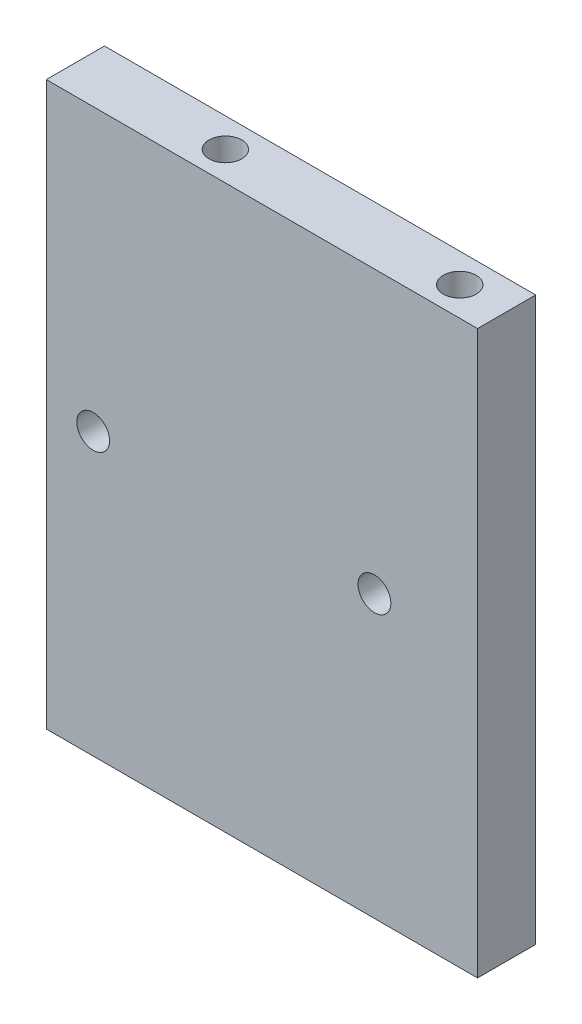
ISO-10303-21;
HEADER;
FILE_DESCRIPTION(('STEP AP214'),'2;1');
FILE_NAME('part.step','',(''),(''),'','','');
FILE_SCHEMA(('AUTOMOTIVE_DESIGN { 1 0 10303 214 1 1 1 1 }'));
ENDSEC;
DATA;
#1=APPLICATION_CONTEXT('core data for automotive mechanical design processes');
#2=APPLICATION_PROTOCOL_DEFINITION('international standard','automotive_design',2000,#1);
#3=PRODUCT_CONTEXT('',#1,'mechanical');
#4=PRODUCT('Part','Part','',(#3));
#5=PRODUCT_RELATED_PRODUCT_CATEGORY('part','',(#4));
#6=PRODUCT_DEFINITION_FORMATION('','',#4);
#7=PRODUCT_DEFINITION_CONTEXT('part definition',#1,'design');
#8=PRODUCT_DEFINITION('design','',#6,#7);
#9=PRODUCT_DEFINITION_SHAPE('','',#8);
#10=(LENGTH_UNIT() NAMED_UNIT(*) SI_UNIT(.MILLI.,.METRE.));
#11=(NAMED_UNIT(*) PLANE_ANGLE_UNIT() SI_UNIT($,.RADIAN.));
#12=(NAMED_UNIT(*) SI_UNIT($,.STERADIAN.) SOLID_ANGLE_UNIT());
#13=UNCERTAINTY_MEASURE_WITH_UNIT(LENGTH_MEASURE(1.E-05),#10,'distance_accuracy_value','');
#14=(GEOMETRIC_REPRESENTATION_CONTEXT(3) GLOBAL_UNCERTAINTY_ASSIGNED_CONTEXT((#13)) GLOBAL_UNIT_ASSIGNED_CONTEXT((#10,
#11,#12)) REPRESENTATION_CONTEXT('',''));
#15=CARTESIAN_POINT('',(0.,0.,0.));
#16=DIRECTION('',(0.,0.,1.));
#17=DIRECTION('',(1.,0.,0.));
#18=AXIS2_PLACEMENT_3D('',#15,#16,#17);
#19=CARTESIAN_POINT('',(23.,30.,6.2));
#20=DIRECTION('',(-1.,0.,0.));
#21=DIRECTION('',(0.,0.,1.));
#22=AXIS2_PLACEMENT_3D('',#19,#20,#21);
#23=PLANE('',#22);
#24=DIRECTION('',(0.,1.,0.));
#25=VECTOR('',#24,1.);
#26=CARTESIAN_POINT('',(23.,30.,0.));
#27=LINE('',#26,#25);
#28=CARTESIAN_POINT('',(23.,-30.,0.));
#29=VERTEX_POINT('',#28);
#30=CARTESIAN_POINT('',(23.,30.,0.));
#31=VERTEX_POINT('',#30);
#32=EDGE_CURVE('E116',#29,#31,#27,.T.);
#33=ORIENTED_EDGE('',*,*,#32,.T.);
#34=DIRECTION('',(0.,0.,-1.));
#35=VECTOR('',#34,1.);
#36=CARTESIAN_POINT('',(23.,30.,6.2));
#37=LINE('',#36,#35);
#38=CARTESIAN_POINT('',(23.,30.,6.2));
#39=VERTEX_POINT('',#38);
#40=EDGE_CURVE('E12',#39,#31,#37,.T.);
#41=ORIENTED_EDGE('',*,*,#40,.F.);
#42=DIRECTION('',(0.,1.,0.));
#43=VECTOR('',#42,1.);
#44=CARTESIAN_POINT('',(23.,30.,6.2));
#45=LINE('',#44,#43);
#46=CARTESIAN_POINT('',(23.,-30.,6.2));
#47=VERTEX_POINT('',#46);
#48=EDGE_CURVE('E100',#47,#39,#45,.T.);
#49=ORIENTED_EDGE('',*,*,#48,.F.);
#50=DIRECTION('',(0.,0.,-1.));
#51=VECTOR('',#50,1.);
#52=CARTESIAN_POINT('',(23.,-30.,6.2));
#53=LINE('',#52,#51);
#54=EDGE_CURVE('E112',#47,#29,#53,.T.);
#55=ORIENTED_EDGE('',*,*,#54,.T.);
#56=EDGE_LOOP('',(#33,#41,#49,#55));
#57=FACE_BOUND('',#56,.T.);
#58=ADVANCED_FACE('F48',(#57),#23,.F.);
#59=CARTESIAN_POINT('',(-23.,30.,6.2));
#60=DIRECTION('',(0.,-1.,0.));
#61=DIRECTION('',(0.,0.,-1.));
#62=AXIS2_PLACEMENT_3D('',#59,#60,#61);
#63=PLANE('',#62);
#64=CARTESIAN_POINT('',(18.,30.,3.1));
#65=DIRECTION('',(0.,1.,0.));
#66=DIRECTION('',(0.,0.,1.));
#67=AXIS2_PLACEMENT_3D('',#64,#65,#66);
#68=CIRCLE('',#67,1.75);
#69=CARTESIAN_POINT('',(18.,30.,4.85));
#70=VERTEX_POINT('',#69);
#71=EDGE_CURVE('E184',#70,#70,#68,.T.);
#72=ORIENTED_EDGE('',*,*,#71,.F.);
#73=EDGE_LOOP('',(#72));
#74=FACE_BOUND('',#73,.T.);
#75=CARTESIAN_POINT('',(-7.,30.,3.1));
#76=DIRECTION('',(0.,1.,0.));
#77=DIRECTION('',(0.,0.,1.));
#78=AXIS2_PLACEMENT_3D('',#75,#76,#77);
#79=CIRCLE('',#78,1.75);
#80=CARTESIAN_POINT('',(-7.,30.,4.85));
#81=VERTEX_POINT('',#80);
#82=EDGE_CURVE('E176',#81,#81,#79,.T.);
#83=ORIENTED_EDGE('',*,*,#82,.F.);
#84=EDGE_LOOP('',(#83));
#85=FACE_BOUND('',#84,.T.);
#86=DIRECTION('',(-1.,0.,0.));
#87=VECTOR('',#86,1.);
#88=CARTESIAN_POINT('',(-23.,30.,0.));
#89=LINE('',#88,#87);
#90=CARTESIAN_POINT('',(-23.,30.,0.));
#91=VERTEX_POINT('',#90);
#92=EDGE_CURVE('E105',#31,#91,#89,.T.);
#93=ORIENTED_EDGE('',*,*,#92,.T.);
#94=DIRECTION('',(0.,0.,-1.));
#95=VECTOR('',#94,1.);
#96=CARTESIAN_POINT('',(-23.,30.,6.2));
#97=LINE('',#96,#95);
#98=CARTESIAN_POINT('',(-23.,30.,6.2));
#99=VERTEX_POINT('',#98);
#100=EDGE_CURVE('E57',#99,#91,#97,.T.);
#101=ORIENTED_EDGE('',*,*,#100,.F.);
#102=DIRECTION('',(-1.,0.,0.));
#103=VECTOR('',#102,1.);
#104=CARTESIAN_POINT('',(-23.,30.,6.2));
#105=LINE('',#104,#103);
#106=EDGE_CURVE('E95',#39,#99,#105,.T.);
#107=ORIENTED_EDGE('',*,*,#106,.F.);
#108=ORIENTED_EDGE('',*,*,#40,.T.);
#109=EDGE_LOOP('',(#93,#101,#107,#108));
#110=FACE_BOUND('',#109,.T.);
#111=ADVANCED_FACE('F104',(#74,#85,#110),#63,.F.);
#112=CARTESIAN_POINT('',(-23.,30.,6.2));
#113=DIRECTION('',(1.,0.,0.));
#114=DIRECTION('',(0.,0.,-1.));
#115=AXIS2_PLACEMENT_3D('',#112,#113,#114);
#116=PLANE('',#115);
#117=DIRECTION('',(0.,-1.,0.));
#118=VECTOR('',#117,1.);
#119=CARTESIAN_POINT('',(-23.,30.,0.));
#120=LINE('',#119,#118);
#121=CARTESIAN_POINT('',(-23.,-30.,0.));
#122=VERTEX_POINT('',#121);
#123=EDGE_CURVE('E82',#91,#122,#120,.T.);
#124=ORIENTED_EDGE('',*,*,#123,.T.);
#125=DIRECTION('',(0.,0.,-1.));
#126=VECTOR('',#125,1.);
#127=CARTESIAN_POINT('',(-23.,-30.,6.2));
#128=LINE('',#127,#126);
#129=CARTESIAN_POINT('',(-23.,-30.,6.2));
#130=VERTEX_POINT('',#129);
#131=EDGE_CURVE('E107',#130,#122,#128,.T.);
#132=ORIENTED_EDGE('',*,*,#131,.F.);
#133=DIRECTION('',(0.,-1.,0.));
#134=VECTOR('',#133,1.);
#135=CARTESIAN_POINT('',(-23.,30.,6.2));
#136=LINE('',#135,#134);
#137=EDGE_CURVE('E98',#99,#130,#136,.T.);
#138=ORIENTED_EDGE('',*,*,#137,.F.);
#139=ORIENTED_EDGE('',*,*,#100,.T.);
#140=EDGE_LOOP('',(#124,#132,#138,#139));
#141=FACE_BOUND('',#140,.T.);
#142=ADVANCED_FACE('F108',(#141),#116,.F.);
#143=CARTESIAN_POINT('',(-23.,-30.,6.2));
#144=DIRECTION('',(0.,1.,0.));
#145=DIRECTION('',(0.,0.,1.));
#146=AXIS2_PLACEMENT_3D('',#143,#144,#145);
#147=PLANE('',#146);
#148=CARTESIAN_POINT('',(-7.,-30.,3.1));
#149=DIRECTION('',(0.,-1.,0.));
#150=DIRECTION('',(0.,0.,-1.));
#151=AXIS2_PLACEMENT_3D('',#148,#149,#150);
#152=CIRCLE('',#151,1.75);
#153=CARTESIAN_POINT('',(-7.,-30.,1.35));
#154=VERTEX_POINT('',#153);
#155=EDGE_CURVE('E169',#154,#154,#152,.T.);
#156=ORIENTED_EDGE('',*,*,#155,.F.);
#157=EDGE_LOOP('',(#156));
#158=FACE_BOUND('',#157,.T.);
#159=CARTESIAN_POINT('',(18.,-30.,3.1));
#160=DIRECTION('',(0.,-1.,0.));
#161=DIRECTION('',(0.,0.,-1.));
#162=AXIS2_PLACEMENT_3D('',#159,#160,#161);
#163=CIRCLE('',#162,1.75);
#164=CARTESIAN_POINT('',(18.,-30.,1.35));
#165=VERTEX_POINT('',#164);
#166=EDGE_CURVE('E160',#165,#165,#163,.T.);
#167=ORIENTED_EDGE('',*,*,#166,.F.);
#168=EDGE_LOOP('',(#167));
#169=FACE_BOUND('',#168,.T.);
#170=DIRECTION('',(1.,0.,0.));
#171=VECTOR('',#170,1.);
#172=CARTESIAN_POINT('',(-23.,-30.,0.));
#173=LINE('',#172,#171);
#174=EDGE_CURVE('E88',#122,#29,#173,.T.);
#175=ORIENTED_EDGE('',*,*,#174,.T.);
#176=ORIENTED_EDGE('',*,*,#54,.F.);
#177=DIRECTION('',(1.,0.,0.));
#178=VECTOR('',#177,1.);
#179=CARTESIAN_POINT('',(-23.,-30.,6.2));
#180=LINE('',#179,#178);
#181=EDGE_CURVE('E65',#130,#47,#180,.T.);
#182=ORIENTED_EDGE('',*,*,#181,.F.);
#183=ORIENTED_EDGE('',*,*,#131,.T.);
#184=EDGE_LOOP('',(#175,#176,#182,#183));
#185=FACE_BOUND('',#184,.T.);
#186=ADVANCED_FACE('F136',(#158,#169,#185),#147,.F.);
#187=CARTESIAN_POINT('',(0.,0.,6.2));
#188=DIRECTION('',(0.,0.,1.));
#189=DIRECTION('',(1.,0.,0.));
#190=AXIS2_PLACEMENT_3D('',#187,#188,#189);
#191=PLANE('',#190);
#192=CARTESIAN_POINT('',(-18.,0.,6.2));
#193=DIRECTION('',(0.,0.,1.));
#194=DIRECTION('',(1.,0.,0.));
#195=AXIS2_PLACEMENT_3D('',#192,#193,#194);
#196=CIRCLE('',#195,1.75);
#197=CARTESIAN_POINT('',(-16.25,0.,6.2));
#198=VERTEX_POINT('',#197);
#199=EDGE_CURVE('E120',#198,#198,#196,.T.);
#200=ORIENTED_EDGE('',*,*,#199,.F.);
#201=EDGE_LOOP('',(#200));
#202=FACE_BOUND('',#201,.T.);
#203=CARTESIAN_POINT('',(12.,0.,6.2));
#204=DIRECTION('',(0.,0.,1.));
#205=DIRECTION('',(1.,0.,0.));
#206=AXIS2_PLACEMENT_3D('',#203,#204,#205);
#207=CIRCLE('',#206,1.75);
#208=CARTESIAN_POINT('',(13.75,0.,6.2));
#209=VERTEX_POINT('',#208);
#210=EDGE_CURVE('E143',#209,#209,#207,.T.);
#211=ORIENTED_EDGE('',*,*,#210,.F.);
#212=EDGE_LOOP('',(#211));
#213=FACE_BOUND('',#212,.T.);
#214=ORIENTED_EDGE('',*,*,#48,.T.);
#215=ORIENTED_EDGE('',*,*,#106,.T.);
#216=ORIENTED_EDGE('',*,*,#137,.T.);
#217=ORIENTED_EDGE('',*,*,#181,.T.);
#218=EDGE_LOOP('',(#214,#215,#216,#217));
#219=FACE_BOUND('',#218,.T.);
#220=ADVANCED_FACE('F96',(#202,#213,#219),#191,.T.);
#221=CARTESIAN_POINT('',(0.,0.,0.));
#222=DIRECTION('',(0.,0.,1.));
#223=DIRECTION('',(1.,0.,0.));
#224=AXIS2_PLACEMENT_3D('',#221,#222,#223);
#225=PLANE('',#224);
#226=CARTESIAN_POINT('',(-18.,0.,0.));
#227=DIRECTION('',(0.,0.,1.));
#228=DIRECTION('',(1.,0.,0.));
#229=AXIS2_PLACEMENT_3D('',#226,#227,#228);
#230=CIRCLE('',#229,1.75);
#231=CARTESIAN_POINT('',(-16.25,0.,0.));
#232=VERTEX_POINT('',#231);
#233=EDGE_CURVE('E146',#232,#232,#230,.T.);
#234=ORIENTED_EDGE('',*,*,#233,.T.);
#235=EDGE_LOOP('',(#234));
#236=FACE_BOUND('',#235,.T.);
#237=CARTESIAN_POINT('',(12.,0.,0.));
#238=DIRECTION('',(0.,0.,1.));
#239=DIRECTION('',(1.,0.,0.));
#240=AXIS2_PLACEMENT_3D('',#237,#238,#239);
#241=CIRCLE('',#240,1.75);
#242=CARTESIAN_POINT('',(13.75,0.,0.));
#243=VERTEX_POINT('',#242);
#244=EDGE_CURVE('E147',#243,#243,#241,.T.);
#245=ORIENTED_EDGE('',*,*,#244,.T.);
#246=EDGE_LOOP('',(#245));
#247=FACE_BOUND('',#246,.T.);
#248=ORIENTED_EDGE('',*,*,#32,.F.);
#249=ORIENTED_EDGE('',*,*,#174,.F.);
#250=ORIENTED_EDGE('',*,*,#123,.F.);
#251=ORIENTED_EDGE('',*,*,#92,.F.);
#252=EDGE_LOOP('',(#248,#249,#250,#251));
#253=FACE_BOUND('',#252,.T.);
#254=ADVANCED_FACE('F139',(#236,#247,#253),#225,.F.);
#255=CARTESIAN_POINT('',(12.,0.,11.1497474683058));
#256=DIRECTION('',(0.,0.,-1.));
#257=DIRECTION('',(-1.,0.,0.));
#258=AXIS2_PLACEMENT_3D('',#255,#256,#257);
#259=CYLINDRICAL_SURFACE('',#258,1.75);
#260=ORIENTED_EDGE('',*,*,#244,.F.);
#261=EDGE_LOOP('',(#260));
#262=FACE_BOUND('',#261,.T.);
#263=ORIENTED_EDGE('',*,*,#210,.T.);
#264=EDGE_LOOP('',(#263));
#265=FACE_BOUND('',#264,.T.);
#266=ADVANCED_FACE('F247',(#262,#265),#259,.F.);
#267=CARTESIAN_POINT('',(-18.,0.,11.1497474683058));
#268=DIRECTION('',(0.,0.,-1.));
#269=DIRECTION('',(-1.,0.,0.));
#270=AXIS2_PLACEMENT_3D('',#267,#268,#269);
#271=CYLINDRICAL_SURFACE('',#270,1.75);
#272=ORIENTED_EDGE('',*,*,#233,.F.);
#273=EDGE_LOOP('',(#272));
#274=FACE_BOUND('',#273,.T.);
#275=ORIENTED_EDGE('',*,*,#199,.T.);
#276=EDGE_LOOP('',(#275));
#277=FACE_BOUND('',#276,.T.);
#278=ADVANCED_FACE('F256',(#274,#277),#271,.F.);
#279=CARTESIAN_POINT('',(18.,-22.,3.1));
#280=DIRECTION('',(0.,-1.,0.));
#281=DIRECTION('',(0.,0.,-1.));
#282=AXIS2_PLACEMENT_3D('',#279,#280,#281);
#283=CYLINDRICAL_SURFACE('',#282,1.75);
#284=CARTESIAN_POINT('',(18.,-22.,3.1));
#285=DIRECTION('',(0.,-1.,0.));
#286=DIRECTION('',(0.,0.,-1.));
#287=AXIS2_PLACEMENT_3D('',#284,#285,#286);
#288=CIRCLE('',#287,1.75);
#289=CARTESIAN_POINT('',(18.,-22.,1.35));
#290=VERTEX_POINT('',#289);
#291=EDGE_CURVE('E164',#290,#290,#288,.T.);
#292=ORIENTED_EDGE('',*,*,#291,.F.);
#293=EDGE_LOOP('',(#292));
#294=FACE_BOUND('',#293,.T.);
#295=ORIENTED_EDGE('',*,*,#166,.T.);
#296=EDGE_LOOP('',(#295));
#297=FACE_BOUND('',#296,.T.);
#298=ADVANCED_FACE('F265',(#294,#297),#283,.F.);
#299=CARTESIAN_POINT('',(18.,-22.,3.1));
#300=DIRECTION('',(0.,-1.,0.));
#301=DIRECTION('',(0.,0.,-1.));
#302=AXIS2_PLACEMENT_3D('',#299,#300,#301);
#303=PLANE('',#302);
#304=ORIENTED_EDGE('',*,*,#291,.T.);
#305=EDGE_LOOP('',(#304));
#306=FACE_BOUND('',#305,.T.);
#307=ADVANCED_FACE('F281',(#306),#303,.T.);
#308=CARTESIAN_POINT('',(-7.,-22.,3.1));
#309=DIRECTION('',(0.,-1.,0.));
#310=DIRECTION('',(0.,0.,-1.));
#311=AXIS2_PLACEMENT_3D('',#308,#309,#310);
#312=CYLINDRICAL_SURFACE('',#311,1.75);
#313=CARTESIAN_POINT('',(-7.,-22.,3.1));
#314=DIRECTION('',(0.,-1.,0.));
#315=DIRECTION('',(0.,0.,-1.));
#316=AXIS2_PLACEMENT_3D('',#313,#314,#315);
#317=CIRCLE('',#316,1.75);
#318=CARTESIAN_POINT('',(-7.,-22.,1.35));
#319=VERTEX_POINT('',#318);
#320=EDGE_CURVE('E152',#319,#319,#317,.T.);
#321=ORIENTED_EDGE('',*,*,#320,.F.);
#322=EDGE_LOOP('',(#321));
#323=FACE_BOUND('',#322,.T.);
#324=ORIENTED_EDGE('',*,*,#155,.T.);
#325=EDGE_LOOP('',(#324));
#326=FACE_BOUND('',#325,.T.);
#327=ADVANCED_FACE('F216',(#323,#326),#312,.F.);
#328=CARTESIAN_POINT('',(-7.,-22.,3.1));
#329=DIRECTION('',(0.,-1.,0.));
#330=DIRECTION('',(0.,0.,-1.));
#331=AXIS2_PLACEMENT_3D('',#328,#329,#330);
#332=PLANE('',#331);
#333=ORIENTED_EDGE('',*,*,#320,.T.);
#334=EDGE_LOOP('',(#333));
#335=FACE_BOUND('',#334,.T.);
#336=ADVANCED_FACE('F207',(#335),#332,.T.);
#337=CARTESIAN_POINT('',(-7.,22.,3.1));
#338=DIRECTION('',(0.,1.,0.));
#339=DIRECTION('',(0.,0.,1.));
#340=AXIS2_PLACEMENT_3D('',#337,#338,#339);
#341=CYLINDRICAL_SURFACE('',#340,1.75);
#342=CARTESIAN_POINT('',(-7.,22.,3.1));
#343=DIRECTION('',(0.,1.,0.));
#344=DIRECTION('',(0.,0.,1.));
#345=AXIS2_PLACEMENT_3D('',#342,#343,#344);
#346=CIRCLE('',#345,1.75);
#347=CARTESIAN_POINT('',(-7.,22.,4.85));
#348=VERTEX_POINT('',#347);
#349=EDGE_CURVE('E180',#348,#348,#346,.T.);
#350=ORIENTED_EDGE('',*,*,#349,.F.);
#351=EDGE_LOOP('',(#350));
#352=FACE_BOUND('',#351,.T.);
#353=ORIENTED_EDGE('',*,*,#82,.T.);
#354=EDGE_LOOP('',(#353));
#355=FACE_BOUND('',#354,.T.);
#356=ADVANCED_FACE('F205',(#352,#355),#341,.F.);
#357=CARTESIAN_POINT('',(-7.,22.,3.1));
#358=DIRECTION('',(0.,1.,0.));
#359=DIRECTION('',(0.,0.,1.));
#360=AXIS2_PLACEMENT_3D('',#357,#358,#359);
#361=PLANE('',#360);
#362=ORIENTED_EDGE('',*,*,#349,.T.);
#363=EDGE_LOOP('',(#362));
#364=FACE_BOUND('',#363,.T.);
#365=ADVANCED_FACE('F197',(#364),#361,.T.);
#366=CARTESIAN_POINT('',(18.,22.,3.1));
#367=DIRECTION('',(0.,1.,0.));
#368=DIRECTION('',(0.,0.,1.));
#369=AXIS2_PLACEMENT_3D('',#366,#367,#368);
#370=CYLINDRICAL_SURFACE('',#369,1.75);
#371=CARTESIAN_POINT('',(18.,22.,3.1));
#372=DIRECTION('',(0.,1.,0.));
#373=DIRECTION('',(0.,0.,1.));
#374=AXIS2_PLACEMENT_3D('',#371,#372,#373);
#375=CIRCLE('',#374,1.75);
#376=CARTESIAN_POINT('',(18.,22.,4.85));
#377=VERTEX_POINT('',#376);
#378=EDGE_CURVE('E165',#377,#377,#375,.T.);
#379=ORIENTED_EDGE('',*,*,#378,.F.);
#380=EDGE_LOOP('',(#379));
#381=FACE_BOUND('',#380,.T.);
#382=ORIENTED_EDGE('',*,*,#71,.T.);
#383=EDGE_LOOP('',(#382));
#384=FACE_BOUND('',#383,.T.);
#385=ADVANCED_FACE('F194',(#381,#384),#370,.F.);
#386=CARTESIAN_POINT('',(18.,22.,3.1));
#387=DIRECTION('',(0.,1.,0.));
#388=DIRECTION('',(0.,0.,1.));
#389=AXIS2_PLACEMENT_3D('',#386,#387,#388);
#390=PLANE('',#389);
#391=ORIENTED_EDGE('',*,*,#378,.T.);
#392=EDGE_LOOP('',(#391));
#393=FACE_BOUND('',#392,.T.);
#394=ADVANCED_FACE('F192',(#393),#390,.T.);
#395=CLOSED_SHELL('',(#58,#111,#142,#186,#220,#254,#266,#278,#298,#307,#327,#336,#356,#365,#385,#394));
#396=MANIFOLD_SOLID_BREP('B2',#395);
#397=ADVANCED_BREP_SHAPE_REPRESENTATION('',(#18,#396),#14);
#398=SHAPE_DEFINITION_REPRESENTATION(#9,#397);
ENDSEC;
END-ISO-10303-21;
